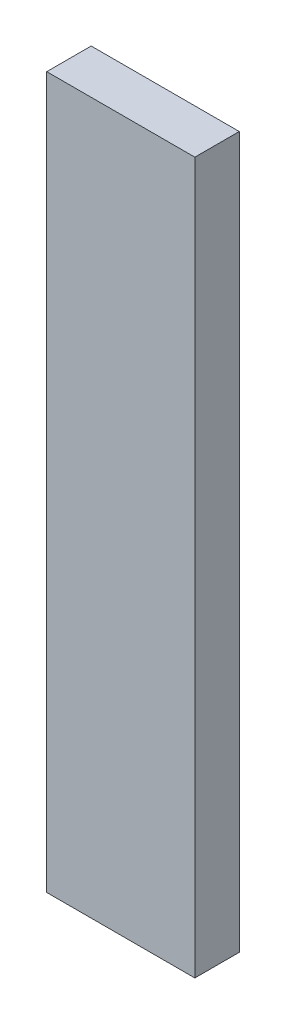
ISO-10303-21;
HEADER;
FILE_DESCRIPTION(('STEP AP214'),'2;1');
FILE_NAME('part.step','',(''),(''),'','','');
FILE_SCHEMA(('AUTOMOTIVE_DESIGN { 1 0 10303 214 1 1 1 1 }'));
ENDSEC;
DATA;
#1=APPLICATION_CONTEXT('core data for automotive mechanical design processes');
#2=APPLICATION_PROTOCOL_DEFINITION('international standard','automotive_design',2000,#1);
#3=PRODUCT_CONTEXT('',#1,'mechanical');
#4=PRODUCT('Part','Part','',(#3));
#5=PRODUCT_RELATED_PRODUCT_CATEGORY('part','',(#4));
#6=PRODUCT_DEFINITION_FORMATION('','',#4);
#7=PRODUCT_DEFINITION_CONTEXT('part definition',#1,'design');
#8=PRODUCT_DEFINITION('design','',#6,#7);
#9=PRODUCT_DEFINITION_SHAPE('','',#8);
#10=(LENGTH_UNIT() NAMED_UNIT(*) SI_UNIT(.MILLI.,.METRE.));
#11=(NAMED_UNIT(*) PLANE_ANGLE_UNIT() SI_UNIT($,.RADIAN.));
#12=(NAMED_UNIT(*) SI_UNIT($,.STERADIAN.) SOLID_ANGLE_UNIT());
#13=UNCERTAINTY_MEASURE_WITH_UNIT(LENGTH_MEASURE(1.E-05),#10,'distance_accuracy_value','');
#14=(GEOMETRIC_REPRESENTATION_CONTEXT(3) GLOBAL_UNCERTAINTY_ASSIGNED_CONTEXT((#13)) GLOBAL_UNIT_ASSIGNED_CONTEXT((#10,
#11,#12)) REPRESENTATION_CONTEXT('',''));
#15=CARTESIAN_POINT('',(0.,0.,0.));
#16=DIRECTION('',(0.,0.,1.));
#17=DIRECTION('',(1.,0.,0.));
#18=AXIS2_PLACEMENT_3D('',#15,#16,#17);
#19=CARTESIAN_POINT('',(0.,304.8,0.));
#20=DIRECTION('',(1.,0.,0.));
#21=DIRECTION('',(0.,0.,-1.));
#22=AXIS2_PLACEMENT_3D('',#19,#20,#21);
#23=PLANE('',#22);
#24=DIRECTION('',(0.,0.,1.));
#25=VECTOR('',#24,1.);
#26=CARTESIAN_POINT('',(0.,0.,0.));
#27=LINE('',#26,#25);
#28=CARTESIAN_POINT('',(0.,0.,-19.05));
#29=VERTEX_POINT('',#28);
#30=CARTESIAN_POINT('',(0.,0.,0.));
#31=VERTEX_POINT('',#30);
#32=EDGE_CURVE('E102',#29,#31,#27,.T.);
#33=ORIENTED_EDGE('',*,*,#32,.T.);
#34=DIRECTION('',(0.,-1.,0.));
#35=VECTOR('',#34,1.);
#36=CARTESIAN_POINT('',(0.,304.8,0.));
#37=LINE('',#36,#35);
#38=CARTESIAN_POINT('',(0.,304.8,0.));
#39=VERTEX_POINT('',#38);
#40=EDGE_CURVE('E11',#39,#31,#37,.T.);
#41=ORIENTED_EDGE('',*,*,#40,.F.);
#42=DIRECTION('',(0.,0.,1.));
#43=VECTOR('',#42,1.);
#44=CARTESIAN_POINT('',(0.,304.8,0.));
#45=LINE('',#44,#43);
#46=CARTESIAN_POINT('',(0.,304.8,-19.05));
#47=VERTEX_POINT('',#46);
#48=EDGE_CURVE('E90',#47,#39,#45,.T.);
#49=ORIENTED_EDGE('',*,*,#48,.F.);
#50=DIRECTION('',(0.,-1.,0.));
#51=VECTOR('',#50,1.);
#52=CARTESIAN_POINT('',(0.,304.8,-19.05));
#53=LINE('',#52,#51);
#54=EDGE_CURVE('E98',#47,#29,#53,.T.);
#55=ORIENTED_EDGE('',*,*,#54,.T.);
#56=EDGE_LOOP('',(#33,#41,#49,#55));
#57=FACE_BOUND('',#56,.T.);
#58=ADVANCED_FACE('F39',(#57),#23,.F.);
#59=CARTESIAN_POINT('',(0.,304.8,0.));
#60=DIRECTION('',(0.,0.,-1.));
#61=DIRECTION('',(-1.,0.,0.));
#62=AXIS2_PLACEMENT_3D('',#59,#60,#61);
#63=PLANE('',#62);
#64=DIRECTION('',(1.,0.,0.));
#65=VECTOR('',#64,1.);
#66=CARTESIAN_POINT('',(0.,0.,0.));
#67=LINE('',#66,#65);
#68=CARTESIAN_POINT('',(63.5,0.,0.));
#69=VERTEX_POINT('',#68);
#70=EDGE_CURVE('E94',#31,#69,#67,.T.);
#71=ORIENTED_EDGE('',*,*,#70,.T.);
#72=DIRECTION('',(0.,-1.,0.));
#73=VECTOR('',#72,1.);
#74=CARTESIAN_POINT('',(63.5,304.8,0.));
#75=LINE('',#74,#73);
#76=CARTESIAN_POINT('',(63.5,304.8,0.));
#77=VERTEX_POINT('',#76);
#78=EDGE_CURVE('E47',#77,#69,#75,.T.);
#79=ORIENTED_EDGE('',*,*,#78,.F.);
#80=DIRECTION('',(1.,0.,0.));
#81=VECTOR('',#80,1.);
#82=CARTESIAN_POINT('',(0.,304.8,0.));
#83=LINE('',#82,#81);
#84=EDGE_CURVE('E85',#39,#77,#83,.T.);
#85=ORIENTED_EDGE('',*,*,#84,.F.);
#86=ORIENTED_EDGE('',*,*,#40,.T.);
#87=EDGE_LOOP('',(#71,#79,#85,#86));
#88=FACE_BOUND('',#87,.T.);
#89=ADVANCED_FACE('F93',(#88),#63,.F.);
#90=CARTESIAN_POINT('',(63.5,304.8,0.));
#91=DIRECTION('',(-1.,0.,0.));
#92=DIRECTION('',(0.,0.,1.));
#93=AXIS2_PLACEMENT_3D('',#90,#91,#92);
#94=PLANE('',#93);
#95=DIRECTION('',(0.,0.,-1.));
#96=VECTOR('',#95,1.);
#97=CARTESIAN_POINT('',(63.5,0.,0.));
#98=LINE('',#97,#96);
#99=CARTESIAN_POINT('',(63.5,0.,-19.05));
#100=VERTEX_POINT('',#99);
#101=EDGE_CURVE('E72',#69,#100,#98,.T.);
#102=ORIENTED_EDGE('',*,*,#101,.T.);
#103=DIRECTION('',(0.,-1.,0.));
#104=VECTOR('',#103,1.);
#105=CARTESIAN_POINT('',(63.5,304.8,-19.05));
#106=LINE('',#105,#104);
#107=CARTESIAN_POINT('',(63.5,304.8,-19.05));
#108=VERTEX_POINT('',#107);
#109=EDGE_CURVE('E95',#108,#100,#106,.T.);
#110=ORIENTED_EDGE('',*,*,#109,.F.);
#111=DIRECTION('',(0.,0.,-1.));
#112=VECTOR('',#111,1.);
#113=CARTESIAN_POINT('',(63.5,304.8,0.));
#114=LINE('',#113,#112);
#115=EDGE_CURVE('E88',#77,#108,#114,.T.);
#116=ORIENTED_EDGE('',*,*,#115,.F.);
#117=ORIENTED_EDGE('',*,*,#78,.T.);
#118=EDGE_LOOP('',(#102,#110,#116,#117));
#119=FACE_BOUND('',#118,.T.);
#120=ADVANCED_FACE('F96',(#119),#94,.F.);
#121=CARTESIAN_POINT('',(0.,304.8,-19.05));
#122=DIRECTION('',(0.,0.,1.));
#123=DIRECTION('',(1.,0.,0.));
#124=AXIS2_PLACEMENT_3D('',#121,#122,#123);
#125=PLANE('',#124);
#126=DIRECTION('',(-1.,0.,0.));
#127=VECTOR('',#126,1.);
#128=CARTESIAN_POINT('',(0.,0.,-19.05));
#129=LINE('',#128,#127);
#130=EDGE_CURVE('E78',#100,#29,#129,.T.);
#131=ORIENTED_EDGE('',*,*,#130,.T.);
#132=ORIENTED_EDGE('',*,*,#54,.F.);
#133=DIRECTION('',(-1.,0.,0.));
#134=VECTOR('',#133,1.);
#135=CARTESIAN_POINT('',(0.,304.8,-19.05));
#136=LINE('',#135,#134);
#137=EDGE_CURVE('E55',#108,#47,#136,.T.);
#138=ORIENTED_EDGE('',*,*,#137,.F.);
#139=ORIENTED_EDGE('',*,*,#109,.T.);
#140=EDGE_LOOP('',(#131,#132,#138,#139));
#141=FACE_BOUND('',#140,.T.);
#142=ADVANCED_FACE('F109',(#141),#125,.F.);
#143=CARTESIAN_POINT('',(0.,304.8,0.));
#144=DIRECTION('',(0.,-1.,0.));
#145=DIRECTION('',(0.,0.,-1.));
#146=AXIS2_PLACEMENT_3D('',#143,#144,#145);
#147=PLANE('',#146);
#148=ORIENTED_EDGE('',*,*,#48,.T.);
#149=ORIENTED_EDGE('',*,*,#84,.T.);
#150=ORIENTED_EDGE('',*,*,#115,.T.);
#151=ORIENTED_EDGE('',*,*,#137,.T.);
#152=EDGE_LOOP('',(#148,#149,#150,#151));
#153=FACE_BOUND('',#152,.T.);
#154=ADVANCED_FACE('F86',(#153),#147,.F.);
#155=CARTESIAN_POINT('',(0.,0.,0.));
#156=DIRECTION('',(0.,-1.,0.));
#157=DIRECTION('',(0.,0.,-1.));
#158=AXIS2_PLACEMENT_3D('',#155,#156,#157);
#159=PLANE('',#158);
#160=ORIENTED_EDGE('',*,*,#32,.F.);
#161=ORIENTED_EDGE('',*,*,#130,.F.);
#162=ORIENTED_EDGE('',*,*,#101,.F.);
#163=ORIENTED_EDGE('',*,*,#70,.F.);
#164=EDGE_LOOP('',(#160,#161,#162,#163));
#165=FACE_BOUND('',#164,.T.);
#166=ADVANCED_FACE('F112',(#165),#159,.T.);
#167=CLOSED_SHELL('',(#58,#89,#120,#142,#154,#166));
#168=MANIFOLD_SOLID_BREP('B2',#167);
#169=ADVANCED_BREP_SHAPE_REPRESENTATION('',(#18,#168),#14);
#170=SHAPE_DEFINITION_REPRESENTATION(#9,#169);
ENDSEC;
END-ISO-10303-21;
